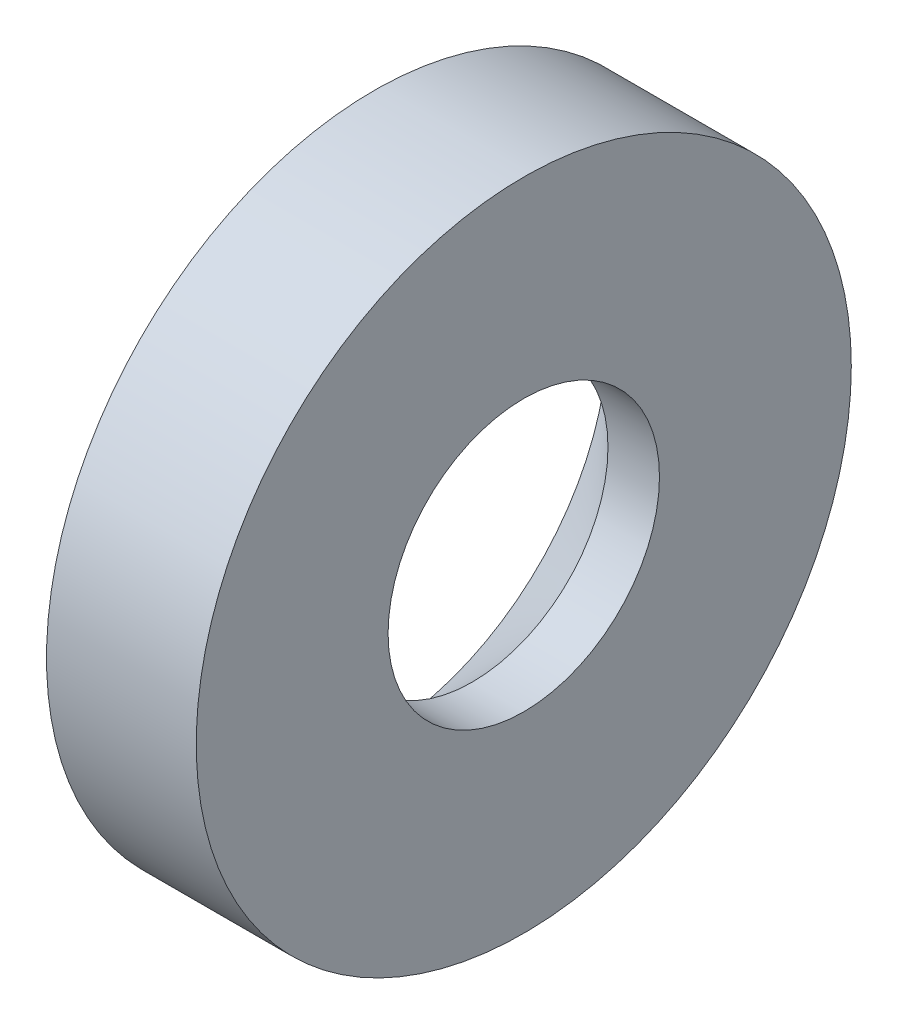
ISO-10303-21;
HEADER;
FILE_DESCRIPTION(('STEP AP214'),'2;1');
FILE_NAME('part.step','',(''),(''),'','','');
FILE_SCHEMA(('AUTOMOTIVE_DESIGN { 1 0 10303 214 1 1 1 1 }'));
ENDSEC;
DATA;
#1=APPLICATION_CONTEXT('core data for automotive mechanical design processes');
#2=APPLICATION_PROTOCOL_DEFINITION('international standard','automotive_design',2000,#1);
#3=PRODUCT_CONTEXT('',#1,'mechanical');
#4=PRODUCT('Part','Part','',(#3));
#5=PRODUCT_RELATED_PRODUCT_CATEGORY('part','',(#4));
#6=PRODUCT_DEFINITION_FORMATION('','',#4);
#7=PRODUCT_DEFINITION_CONTEXT('part definition',#1,'design');
#8=PRODUCT_DEFINITION('design','',#6,#7);
#9=PRODUCT_DEFINITION_SHAPE('','',#8);
#10=(LENGTH_UNIT() NAMED_UNIT(*) SI_UNIT(.MILLI.,.METRE.));
#11=(NAMED_UNIT(*) PLANE_ANGLE_UNIT() SI_UNIT($,.RADIAN.));
#12=(NAMED_UNIT(*) SI_UNIT($,.STERADIAN.) SOLID_ANGLE_UNIT());
#13=UNCERTAINTY_MEASURE_WITH_UNIT(LENGTH_MEASURE(1.E-05),#10,'distance_accuracy_value','');
#14=(GEOMETRIC_REPRESENTATION_CONTEXT(3) GLOBAL_UNCERTAINTY_ASSIGNED_CONTEXT((#13)) GLOBAL_UNIT_ASSIGNED_CONTEXT((#10,
#11,#12)) REPRESENTATION_CONTEXT('',''));
#15=CARTESIAN_POINT('',(0.,0.,0.));
#16=DIRECTION('',(0.,0.,1.));
#17=DIRECTION('',(1.,0.,0.));
#18=AXIS2_PLACEMENT_3D('',#15,#16,#17);
#19=CARTESIAN_POINT('',(-4.,0.,0.));
#20=DIRECTION('',(1.,0.,0.));
#21=DIRECTION('',(0.,0.,-1.));
#22=AXIS2_PLACEMENT_3D('',#19,#20,#21);
#23=PLANE('',#22);
#24=CARTESIAN_POINT('',(-4.,0.,0.));
#25=DIRECTION('',(1.,0.,0.));
#26=DIRECTION('',(0.,0.,-1.));
#27=AXIS2_PLACEMENT_3D('',#24,#25,#26);
#28=CIRCLE('',#27,17.5);
#29=CARTESIAN_POINT('',(-4.,0.,-17.5));
#30=VERTEX_POINT('',#29);
#31=EDGE_CURVE('E58',#30,#30,#28,.T.);
#32=ORIENTED_EDGE('',*,*,#31,.F.);
#33=EDGE_LOOP('',(#32));
#34=FACE_BOUND('',#33,.T.);
#35=CARTESIAN_POINT('',(-4.,0.,0.));
#36=DIRECTION('',(-1.,0.,0.));
#37=DIRECTION('',(0.,0.,1.));
#38=AXIS2_PLACEMENT_3D('',#35,#36,#37);
#39=CIRCLE('',#38,12.5);
#40=CARTESIAN_POINT('',(-4.,0.,12.5));
#41=VERTEX_POINT('',#40);
#42=EDGE_CURVE('E69',#41,#41,#39,.T.);
#43=ORIENTED_EDGE('',*,*,#42,.F.);
#44=EDGE_LOOP('',(#43));
#45=FACE_BOUND('',#44,.T.);
#46=ADVANCED_FACE('F55',(#34,#45),#23,.F.);
#47=CARTESIAN_POINT('',(4.,0.,0.));
#48=DIRECTION('',(-1.,0.,0.));
#49=DIRECTION('',(0.,0.,1.));
#50=AXIS2_PLACEMENT_3D('',#47,#48,#49);
#51=CYLINDRICAL_SURFACE('',#50,17.5);
#52=CARTESIAN_POINT('',(4.,0.,0.));
#53=DIRECTION('',(1.,0.,0.));
#54=DIRECTION('',(0.,0.,-1.));
#55=AXIS2_PLACEMENT_3D('',#52,#53,#54);
#56=CIRCLE('',#55,17.5);
#57=CARTESIAN_POINT('',(4.,0.,-17.5));
#58=VERTEX_POINT('',#57);
#59=EDGE_CURVE('E11',#58,#58,#56,.T.);
#60=ORIENTED_EDGE('',*,*,#59,.F.);
#61=EDGE_LOOP('',(#60));
#62=FACE_BOUND('',#61,.T.);
#63=ORIENTED_EDGE('',*,*,#31,.T.);
#64=EDGE_LOOP('',(#63));
#65=FACE_BOUND('',#64,.T.);
#66=ADVANCED_FACE('F53',(#62,#65),#51,.T.);
#67=CARTESIAN_POINT('',(4.,0.,0.));
#68=DIRECTION('',(1.,0.,0.));
#69=DIRECTION('',(0.,0.,-1.));
#70=AXIS2_PLACEMENT_3D('',#67,#68,#69);
#71=PLANE('',#70);
#72=CARTESIAN_POINT('',(4.,0.,0.));
#73=DIRECTION('',(1.,0.,0.));
#74=DIRECTION('',(0.,0.,-1.));
#75=AXIS2_PLACEMENT_3D('',#72,#73,#74);
#76=CIRCLE('',#75,7.24999999999999);
#77=CARTESIAN_POINT('',(4.,0.,-7.24999999999999));
#78=VERTEX_POINT('',#77);
#79=EDGE_CURVE('E57',#78,#78,#76,.T.);
#80=ORIENTED_EDGE('',*,*,#79,.F.);
#81=EDGE_LOOP('',(#80));
#82=FACE_BOUND('',#81,.T.);
#83=ORIENTED_EDGE('',*,*,#59,.T.);
#84=EDGE_LOOP('',(#83));
#85=FACE_BOUND('',#84,.T.);
#86=ADVANCED_FACE('F83',(#82,#85),#71,.T.);
#87=CARTESIAN_POINT('',(-4.,0.,0.));
#88=DIRECTION('',(-1.,0.,0.));
#89=DIRECTION('',(0.,0.,1.));
#90=AXIS2_PLACEMENT_3D('',#87,#88,#89);
#91=CYLINDRICAL_SURFACE('',#90,7.24999999999999);
#92=ORIENTED_EDGE('',*,*,#79,.T.);
#93=EDGE_LOOP('',(#92));
#94=FACE_BOUND('',#93,.T.);
#95=CARTESIAN_POINT('',(1.24999999999999,0.,0.));
#96=DIRECTION('',(-1.,0.,0.));
#97=DIRECTION('',(0.,0.,1.));
#98=AXIS2_PLACEMENT_3D('',#95,#96,#97);
#99=CIRCLE('',#98,7.25);
#100=CARTESIAN_POINT('',(1.24999999999999,0.,7.25));
#101=VERTEX_POINT('',#100);
#102=EDGE_CURVE('E67',#101,#101,#99,.T.);
#103=ORIENTED_EDGE('',*,*,#102,.T.);
#104=EDGE_LOOP('',(#103));
#105=FACE_BOUND('',#104,.T.);
#106=ADVANCED_FACE('F86',(#94,#105),#91,.F.);
#107=CARTESIAN_POINT('',(-4.,0.,0.));
#108=DIRECTION('',(-1.,0.,0.));
#109=DIRECTION('',(0.,0.,1.));
#110=AXIS2_PLACEMENT_3D('',#107,#108,#109);
#111=CONICAL_SURFACE('',#110,12.5,0.785398163397449);
#112=ORIENTED_EDGE('',*,*,#102,.F.);
#113=EDGE_LOOP('',(#112));
#114=FACE_BOUND('',#113,.T.);
#115=ORIENTED_EDGE('',*,*,#42,.T.);
#116=EDGE_LOOP('',(#115));
#117=FACE_BOUND('',#116,.T.);
#118=ADVANCED_FACE('F71',(#114,#117),#111,.F.);
#119=CLOSED_SHELL('',(#46,#66,#86,#106,#118));
#120=MANIFOLD_SOLID_BREP('B2',#119);
#121=ADVANCED_BREP_SHAPE_REPRESENTATION('',(#18,#120),#14);
#122=SHAPE_DEFINITION_REPRESENTATION(#9,#121);
ENDSEC;
END-ISO-10303-21;
